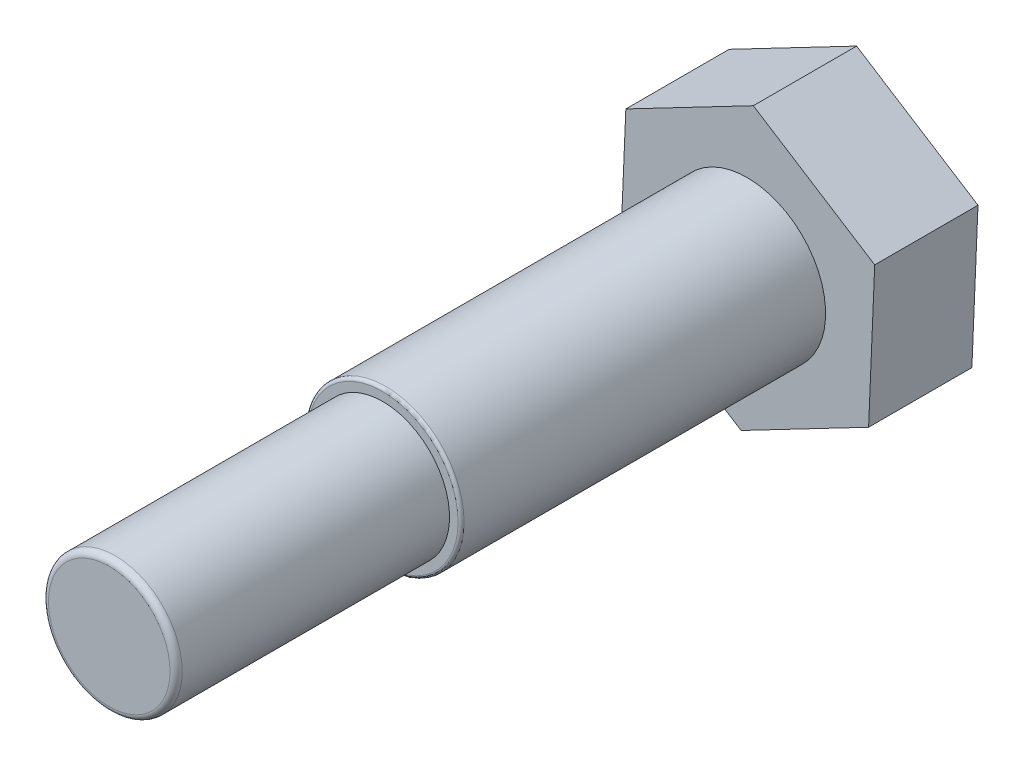
ISO-10303-21;
HEADER;
FILE_DESCRIPTION(('STEP AP214'),'2;1');
FILE_NAME('part.step','',(''),(''),'','','');
FILE_SCHEMA(('AUTOMOTIVE_DESIGN { 1 0 10303 214 1 1 1 1 }'));
ENDSEC;
DATA;
#1=APPLICATION_CONTEXT('core data for automotive mechanical design processes');
#2=APPLICATION_PROTOCOL_DEFINITION('international standard','automotive_design',2000,#1);
#3=PRODUCT_CONTEXT('',#1,'mechanical');
#4=PRODUCT('Part','Part','',(#3));
#5=PRODUCT_RELATED_PRODUCT_CATEGORY('part','',(#4));
#6=PRODUCT_DEFINITION_FORMATION('','',#4);
#7=PRODUCT_DEFINITION_CONTEXT('part definition',#1,'design');
#8=PRODUCT_DEFINITION('design','',#6,#7);
#9=PRODUCT_DEFINITION_SHAPE('','',#8);
#10=(LENGTH_UNIT() NAMED_UNIT(*) SI_UNIT(.MILLI.,.METRE.));
#11=(NAMED_UNIT(*) PLANE_ANGLE_UNIT() SI_UNIT($,.RADIAN.));
#12=(NAMED_UNIT(*) SI_UNIT($,.STERADIAN.) SOLID_ANGLE_UNIT());
#13=UNCERTAINTY_MEASURE_WITH_UNIT(LENGTH_MEASURE(1.E-05),#10,'distance_accuracy_value','');
#14=(GEOMETRIC_REPRESENTATION_CONTEXT(3) GLOBAL_UNCERTAINTY_ASSIGNED_CONTEXT((#13)) GLOBAL_UNIT_ASSIGNED_CONTEXT((#10,
#11,#12)) REPRESENTATION_CONTEXT('',''));
#15=CARTESIAN_POINT('',(0.,0.,0.));
#16=DIRECTION('',(0.,0.,1.));
#17=DIRECTION('',(1.,0.,0.));
#18=AXIS2_PLACEMENT_3D('',#15,#16,#17);
#19=CARTESIAN_POINT('',(19.9787997617734,-12.6957037383635,17.));
#20=DIRECTION('',(-0.999097599975706,0.0424733530909036,0.));
#21=DIRECTION('',(-0.0424733530909036,-0.999097599975706,0.));
#22=AXIS2_PLACEMENT_3D('',#19,#20,#21);
#23=PLANE('',#22);
#24=DIRECTION('',(0.0424733530909036,0.999097599975706,0.));
#25=VECTOR('',#24,1.);
#26=CARTESIAN_POINT('',(19.9787997617734,-12.6957037383635,0.));
#27=LINE('',#26,#25);
#28=CARTESIAN_POINT('',(19.9787997617734,-12.6957037383635,0.));
#29=VERTEX_POINT('',#28);
#30=CARTESIAN_POINT('',(20.9842018372306,10.9542962616365,0.));
#31=VERTEX_POINT('',#30);
#32=EDGE_CURVE('E121',#29,#31,#27,.T.);
#33=ORIENTED_EDGE('',*,*,#32,.T.);
#34=DIRECTION('',(0.,0.,-1.));
#35=VECTOR('',#34,1.);
#36=CARTESIAN_POINT('',(20.9842018372306,10.9542962616365,17.));
#37=LINE('',#36,#35);
#38=CARTESIAN_POINT('',(20.9842018372306,10.9542962616365,17.));
#39=VERTEX_POINT('',#38);
#40=EDGE_CURVE('E139',#39,#31,#37,.T.);
#41=ORIENTED_EDGE('',*,*,#40,.F.);
#42=DIRECTION('',(0.0424733530909036,0.999097599975706,0.));
#43=VECTOR('',#42,1.);
#44=CARTESIAN_POINT('',(19.9787997617734,-12.6957037383635,17.));
#45=LINE('',#44,#43);
#46=CARTESIAN_POINT('',(19.9787997617734,-12.6957037383635,17.));
#47=VERTEX_POINT('',#46);
#48=EDGE_CURVE('E132',#47,#39,#45,.T.);
#49=ORIENTED_EDGE('',*,*,#48,.F.);
#50=DIRECTION('',(0.,0.,-1.));
#51=VECTOR('',#50,1.);
#52=CARTESIAN_POINT('',(19.9787997617734,-12.6957037383635,17.));
#53=LINE('',#52,#51);
#54=EDGE_CURVE('E117',#47,#29,#53,.T.);
#55=ORIENTED_EDGE('',*,*,#54,.T.);
#56=EDGE_LOOP('',(#33,#41,#49,#55));
#57=FACE_BOUND('',#56,.T.);
#58=ADVANCED_FACE('F35',(#57),#23,.F.);
#59=CARTESIAN_POINT('',(20.9842018372306,10.9542962616365,17.));
#60=DIRECTION('',(-0.536331802748482,-0.844007225893572,0.));
#61=DIRECTION('',(0.844007225893572,-0.536331802748482,0.));
#62=AXIS2_PLACEMENT_3D('',#59,#60,#61);
#63=PLANE('',#62);
#64=DIRECTION('',(-0.844007225893572,0.536331802748482,0.));
#65=VECTOR('',#64,1.);
#66=CARTESIAN_POINT('',(20.9842018372306,10.9542962616365,0.));
#67=LINE('',#66,#65);
#68=CARTESIAN_POINT('',(1.0054020754572,23.65,0.));
#69=VERTEX_POINT('',#68);
#70=EDGE_CURVE('E124',#31,#69,#67,.T.);
#71=ORIENTED_EDGE('',*,*,#70,.T.);
#72=DIRECTION('',(0.,0.,-1.));
#73=VECTOR('',#72,1.);
#74=CARTESIAN_POINT('',(1.0054020754572,23.65,17.));
#75=LINE('',#74,#73);
#76=CARTESIAN_POINT('',(1.0054020754572,23.65,17.));
#77=VERTEX_POINT('',#76);
#78=EDGE_CURVE('E136',#77,#69,#75,.T.);
#79=ORIENTED_EDGE('',*,*,#78,.F.);
#80=DIRECTION('',(-0.844007225893572,0.536331802748482,0.));
#81=VECTOR('',#80,1.);
#82=CARTESIAN_POINT('',(20.9842018372306,10.9542962616365,17.));
#83=LINE('',#82,#81);
#84=EDGE_CURVE('E90',#39,#77,#83,.T.);
#85=ORIENTED_EDGE('',*,*,#84,.F.);
#86=ORIENTED_EDGE('',*,*,#40,.T.);
#87=EDGE_LOOP('',(#71,#79,#85,#86));
#88=FACE_BOUND('',#87,.T.);
#89=ADVANCED_FACE('F165',(#88),#63,.F.);
#90=CARTESIAN_POINT('',(1.0054020754572,23.65,17.));
#91=DIRECTION('',(0.462765797227231,-0.886480578984472,0.));
#92=DIRECTION('',(0.886480578984472,0.462765797227231,0.));
#93=AXIS2_PLACEMENT_3D('',#90,#91,#92);
#94=PLANE('',#93);
#95=DIRECTION('',(-0.886480578984472,-0.462765797227231,0.));
#96=VECTOR('',#95,1.);
#97=CARTESIAN_POINT('',(1.0054020754572,23.65,0.));
#98=LINE('',#97,#96);
#99=CARTESIAN_POINT('',(-19.9787997617736,12.6957037383632,0.));
#100=VERTEX_POINT('',#99);
#101=EDGE_CURVE('E127',#69,#100,#98,.T.);
#102=ORIENTED_EDGE('',*,*,#101,.T.);
#103=DIRECTION('',(0.,0.,-1.));
#104=VECTOR('',#103,1.);
#105=CARTESIAN_POINT('',(-19.9787997617736,12.6957037383632,17.));
#106=LINE('',#105,#104);
#107=CARTESIAN_POINT('',(-19.9787997617736,12.6957037383632,17.));
#108=VERTEX_POINT('',#107);
#109=EDGE_CURVE('E112',#108,#100,#106,.T.);
#110=ORIENTED_EDGE('',*,*,#109,.F.);
#111=DIRECTION('',(-0.886480578984472,-0.462765797227231,0.));
#112=VECTOR('',#111,1.);
#113=CARTESIAN_POINT('',(1.0054020754572,23.65,17.));
#114=LINE('',#113,#112);
#115=EDGE_CURVE('E103',#77,#108,#114,.T.);
#116=ORIENTED_EDGE('',*,*,#115,.F.);
#117=ORIENTED_EDGE('',*,*,#78,.T.);
#118=EDGE_LOOP('',(#102,#110,#116,#117));
#119=FACE_BOUND('',#118,.T.);
#120=ADVANCED_FACE('F171',(#119),#94,.F.);
#121=CARTESIAN_POINT('',(-19.9787997617736,12.6957037383632,17.));
#122=DIRECTION('',(0.999097599975706,-0.0424733530908878,0.));
#123=DIRECTION('',(0.0424733530908878,0.999097599975707,0.));
#124=AXIS2_PLACEMENT_3D('',#121,#122,#123);
#125=PLANE('',#124);
#126=DIRECTION('',(-0.0424733530908878,-0.999097599975706,0.));
#127=VECTOR('',#126,1.);
#128=CARTESIAN_POINT('',(-19.9787997617736,12.6957037383632,0.));
#129=LINE('',#128,#127);
#130=CARTESIAN_POINT('',(-20.9842018372304,-10.9542962616368,0.));
#131=VERTEX_POINT('',#130);
#132=EDGE_CURVE('E111',#100,#131,#129,.T.);
#133=ORIENTED_EDGE('',*,*,#132,.T.);
#134=DIRECTION('',(0.,0.,-1.));
#135=VECTOR('',#134,1.);
#136=CARTESIAN_POINT('',(-20.9842018372304,-10.9542962616368,17.));
#137=LINE('',#136,#135);
#138=CARTESIAN_POINT('',(-20.9842018372304,-10.9542962616368,17.));
#139=VERTEX_POINT('',#138);
#140=EDGE_CURVE('E108',#139,#131,#137,.T.);
#141=ORIENTED_EDGE('',*,*,#140,.F.);
#142=DIRECTION('',(-0.0424733530908878,-0.999097599975706,0.));
#143=VECTOR('',#142,1.);
#144=CARTESIAN_POINT('',(-19.9787997617736,12.6957037383632,17.));
#145=LINE('',#144,#143);
#146=EDGE_CURVE('E97',#108,#139,#145,.T.);
#147=ORIENTED_EDGE('',*,*,#146,.F.);
#148=ORIENTED_EDGE('',*,*,#109,.T.);
#149=EDGE_LOOP('',(#133,#141,#147,#148));
#150=FACE_BOUND('',#149,.T.);
#151=ADVANCED_FACE('F109',(#150),#125,.F.);
#152=CARTESIAN_POINT('',(-20.9842018372304,-10.9542962616368,17.));
#153=DIRECTION('',(0.536331802748476,0.844007225893576,0.));
#154=DIRECTION('',(-0.844007225893576,0.536331802748476,0.));
#155=AXIS2_PLACEMENT_3D('',#152,#153,#154);
#156=PLANE('',#155);
#157=DIRECTION('',(0.844007225893576,-0.536331802748476,0.));
#158=VECTOR('',#157,1.);
#159=CARTESIAN_POINT('',(-20.9842018372304,-10.9542962616368,0.));
#160=LINE('',#159,#158);
#161=CARTESIAN_POINT('',(-1.00540207545719,-23.65,0.));
#162=VERTEX_POINT('',#161);
#163=EDGE_CURVE('E75',#131,#162,#160,.T.);
#164=ORIENTED_EDGE('',*,*,#163,.T.);
#165=DIRECTION('',(0.,0.,-1.));
#166=VECTOR('',#165,1.);
#167=CARTESIAN_POINT('',(-1.00540207545719,-23.65,17.));
#168=LINE('',#167,#166);
#169=CARTESIAN_POINT('',(-1.00540207545719,-23.65,17.));
#170=VERTEX_POINT('',#169);
#171=EDGE_CURVE('E113',#170,#162,#168,.T.);
#172=ORIENTED_EDGE('',*,*,#171,.F.);
#173=DIRECTION('',(0.844007225893576,-0.536331802748476,0.));
#174=VECTOR('',#173,1.);
#175=CARTESIAN_POINT('',(-20.9842018372304,-10.9542962616368,17.));
#176=LINE('',#175,#174);
#177=EDGE_CURVE('E101',#139,#170,#176,.T.);
#178=ORIENTED_EDGE('',*,*,#177,.F.);
#179=ORIENTED_EDGE('',*,*,#140,.T.);
#180=EDGE_LOOP('',(#164,#172,#178,#179));
#181=FACE_BOUND('',#180,.T.);
#182=ADVANCED_FACE('F115',(#181),#156,.F.);
#183=CARTESIAN_POINT('',(-1.00540207545719,-23.65,17.));
#184=DIRECTION('',(-0.462765797227224,0.886480578984476,0.));
#185=DIRECTION('',(-0.886480578984476,-0.462765797227224,0.));
#186=AXIS2_PLACEMENT_3D('',#183,#184,#185);
#187=PLANE('',#186);
#188=DIRECTION('',(0.886480578984476,0.462765797227224,0.));
#189=VECTOR('',#188,1.);
#190=CARTESIAN_POINT('',(-1.00540207545719,-23.65,0.));
#191=LINE('',#190,#189);
#192=EDGE_CURVE('E81',#162,#29,#191,.T.);
#193=ORIENTED_EDGE('',*,*,#192,.T.);
#194=ORIENTED_EDGE('',*,*,#54,.F.);
#195=DIRECTION('',(0.886480578984476,0.462765797227224,0.));
#196=VECTOR('',#195,1.);
#197=CARTESIAN_POINT('',(-1.00540207545719,-23.65,17.));
#198=LINE('',#197,#196);
#199=EDGE_CURVE('E52',#170,#47,#198,.T.);
#200=ORIENTED_EDGE('',*,*,#199,.F.);
#201=ORIENTED_EDGE('',*,*,#171,.T.);
#202=EDGE_LOOP('',(#193,#194,#200,#201));
#203=FACE_BOUND('',#202,.T.);
#204=ADVANCED_FACE('F181',(#203),#187,.F.);
#205=CARTESIAN_POINT('',(18.9733976863162,-36.3457037383633,17.));
#206=DIRECTION('',(0.,0.,-1.));
#207=DIRECTION('',(-1.,0.,0.));
#208=AXIS2_PLACEMENT_3D('',#205,#206,#207);
#209=PLANE('',#208);
#210=CARTESIAN_POINT('',(0.,0.,17.));
#211=DIRECTION('',(0.,0.,-1.));
#212=DIRECTION('',(-1.,0.,0.));
#213=AXIS2_PLACEMENT_3D('',#210,#211,#212);
#214=CIRCLE('',#213,12.9);
#215=CARTESIAN_POINT('',(-12.9,0.,17.));
#216=VERTEX_POINT('',#215);
#217=EDGE_CURVE('E141',#216,#216,#214,.F.);
#218=ORIENTED_EDGE('',*,*,#217,.F.);
#219=EDGE_LOOP('',(#218));
#220=FACE_BOUND('',#219,.T.);
#221=ORIENTED_EDGE('',*,*,#48,.T.);
#222=ORIENTED_EDGE('',*,*,#84,.T.);
#223=ORIENTED_EDGE('',*,*,#115,.T.);
#224=ORIENTED_EDGE('',*,*,#146,.T.);
#225=ORIENTED_EDGE('',*,*,#177,.T.);
#226=ORIENTED_EDGE('',*,*,#199,.T.);
#227=EDGE_LOOP('',(#221,#222,#223,#224,#225,#226));
#228=FACE_BOUND('',#227,.T.);
#229=ADVANCED_FACE('F99',(#220,#228),#209,.F.);
#230=CARTESIAN_POINT('',(18.9733976863162,-36.3457037383633,0.));
#231=DIRECTION('',(0.,0.,-1.));
#232=DIRECTION('',(-1.,0.,0.));
#233=AXIS2_PLACEMENT_3D('',#230,#231,#232);
#234=PLANE('',#233);
#235=ORIENTED_EDGE('',*,*,#32,.F.);
#236=ORIENTED_EDGE('',*,*,#192,.F.);
#237=ORIENTED_EDGE('',*,*,#163,.F.);
#238=ORIENTED_EDGE('',*,*,#132,.F.);
#239=ORIENTED_EDGE('',*,*,#101,.F.);
#240=ORIENTED_EDGE('',*,*,#70,.F.);
#241=EDGE_LOOP('',(#235,#236,#237,#238,#239,#240));
#242=FACE_BOUND('',#241,.T.);
#243=ADVANCED_FACE('F184',(#242),#234,.T.);
#244=CARTESIAN_POINT('',(0.,0.,77.));
#245=DIRECTION('',(0.,0.,-1.));
#246=DIRECTION('',(-1.,0.,0.));
#247=AXIS2_PLACEMENT_3D('',#244,#245,#246);
#248=CYLINDRICAL_SURFACE('',#247,12.9);
#249=CARTESIAN_POINT('',(0.,0.,76.5));
#250=DIRECTION('',(0.,0.,1.));
#251=DIRECTION('',(1.,0.,0.));
#252=AXIS2_PLACEMENT_3D('',#249,#250,#251);
#253=CIRCLE('',#252,12.9);
#254=CARTESIAN_POINT('',(12.9,0.,76.5));
#255=VERTEX_POINT('',#254);
#256=EDGE_CURVE('E11',#255,#255,#253,.F.);
#257=ORIENTED_EDGE('',*,*,#256,.T.);
#258=EDGE_LOOP('',(#257));
#259=FACE_BOUND('',#258,.T.);
#260=ORIENTED_EDGE('',*,*,#217,.T.);
#261=EDGE_LOOP('',(#260));
#262=FACE_BOUND('',#261,.T.);
#263=ADVANCED_FACE('F187',(#259,#262),#248,.T.);
#264=CARTESIAN_POINT('',(0.,0.,77.));
#265=DIRECTION('',(0.,0.,1.));
#266=DIRECTION('',(1.,0.,0.));
#267=AXIS2_PLACEMENT_3D('',#264,#265,#266);
#268=PLANE('',#267);
#269=CARTESIAN_POINT('',(0.,0.,77.));
#270=DIRECTION('',(0.,0.,1.));
#271=DIRECTION('',(1.,0.,0.));
#272=AXIS2_PLACEMENT_3D('',#269,#270,#271);
#273=CIRCLE('',#272,12.4);
#274=CARTESIAN_POINT('',(12.4,0.,77.));
#275=VERTEX_POINT('',#274);
#276=EDGE_CURVE('E44',#275,#275,#273,.T.);
#277=ORIENTED_EDGE('',*,*,#276,.T.);
#278=EDGE_LOOP('',(#277));
#279=FACE_BOUND('',#278,.T.);
#280=CARTESIAN_POINT('',(0.,0.,77.));
#281=DIRECTION('',(0.,0.,1.));
#282=DIRECTION('',(1.,0.,0.));
#283=AXIS2_PLACEMENT_3D('',#280,#281,#282);
#284=CIRCLE('',#283,11.);
#285=CARTESIAN_POINT('',(-11.,0.,77.));
#286=VERTEX_POINT('',#285);
#287=EDGE_CURVE('E125',#286,#286,#284,.T.);
#288=ORIENTED_EDGE('',*,*,#287,.F.);
#289=EDGE_LOOP('',(#288));
#290=FACE_BOUND('',#289,.T.);
#291=ADVANCED_FACE('F152',(#279,#290),#268,.T.);
#292=CARTESIAN_POINT('',(0.,0.,122.));
#293=DIRECTION('',(0.,0.,-1.));
#294=DIRECTION('',(-1.,0.,0.));
#295=AXIS2_PLACEMENT_3D('',#292,#293,#294);
#296=CYLINDRICAL_SURFACE('',#295,11.);
#297=CARTESIAN_POINT('',(0.,0.,121.));
#298=DIRECTION('',(0.,0.,1.));
#299=DIRECTION('',(1.,0.,0.));
#300=AXIS2_PLACEMENT_3D('',#297,#298,#299);
#301=CIRCLE('',#300,11.);
#302=CARTESIAN_POINT('',(-11.,0.,121.));
#303=VERTEX_POINT('',#302);
#304=EDGE_CURVE('E147',#303,#303,#301,.F.);
#305=CARTESIAN_POINT('',(-11.,0.,121.));
#306=CARTESIAN_POINT('',(-11.,0.,120.541666666667));
#307=CARTESIAN_POINT('',(-11.,0.,120.083333333333));
#308=CARTESIAN_POINT('',(-11.,0.,119.166666666667));
#309=CARTESIAN_POINT('',(-11.,0.,118.708333333333));
#310=CARTESIAN_POINT('',(-11.,0.,117.791666666667));
#311=CARTESIAN_POINT('',(-11.,0.,117.333333333333));
#312=CARTESIAN_POINT('',(-11.,0.,116.416666666667));
#313=CARTESIAN_POINT('',(-11.,0.,115.958333333333));
#314=CARTESIAN_POINT('',(-11.,0.,115.041666666667));
#315=CARTESIAN_POINT('',(-11.,0.,114.583333333333));
#316=CARTESIAN_POINT('',(-11.,0.,113.666666666667));
#317=CARTESIAN_POINT('',(-11.,0.,113.208333333333));
#318=CARTESIAN_POINT('',(-11.,0.,112.291666666667));
#319=CARTESIAN_POINT('',(-11.,0.,111.833333333333));
#320=CARTESIAN_POINT('',(-11.,0.,110.916666666667));
#321=CARTESIAN_POINT('',(-11.,0.,110.458333333333));
#322=CARTESIAN_POINT('',(-11.,0.,109.541666666667));
#323=CARTESIAN_POINT('',(-11.,0.,109.083333333333));
#324=CARTESIAN_POINT('',(-11.,0.,108.166666666667));
#325=CARTESIAN_POINT('',(-11.,0.,107.708333333333));
#326=CARTESIAN_POINT('',(-11.,0.,106.791666666667));
#327=CARTESIAN_POINT('',(-11.,0.,106.333333333333));
#328=CARTESIAN_POINT('',(-11.,0.,105.416666666667));
#329=CARTESIAN_POINT('',(-11.,0.,104.958333333333));
#330=CARTESIAN_POINT('',(-11.,0.,104.041666666667));
#331=CARTESIAN_POINT('',(-11.,0.,103.583333333333));
#332=CARTESIAN_POINT('',(-11.,0.,102.666666666667));
#333=CARTESIAN_POINT('',(-11.,0.,102.208333333333));
#334=CARTESIAN_POINT('',(-11.,0.,101.291666666667));
#335=CARTESIAN_POINT('',(-11.,0.,100.833333333333));
#336=CARTESIAN_POINT('',(-11.,0.,99.9166666666667));
#337=CARTESIAN_POINT('',(-11.,0.,99.4583333333333));
#338=CARTESIAN_POINT('',(-11.,0.,98.5416666666667));
#339=CARTESIAN_POINT('',(-11.,0.,98.0833333333333));
#340=CARTESIAN_POINT('',(-11.,0.,97.1666666666667));
#341=CARTESIAN_POINT('',(-11.,0.,96.7083333333333));
#342=CARTESIAN_POINT('',(-11.,0.,95.7916666666666));
#343=CARTESIAN_POINT('',(-11.,0.,95.3333333333333));
#344=CARTESIAN_POINT('',(-11.,0.,94.4166666666666));
#345=CARTESIAN_POINT('',(-11.,0.,93.9583333333333));
#346=CARTESIAN_POINT('',(-11.,0.,93.0416666666666));
#347=CARTESIAN_POINT('',(-11.,0.,92.5833333333333));
#348=CARTESIAN_POINT('',(-11.,0.,91.6666666666667));
#349=CARTESIAN_POINT('',(-11.,0.,91.2083333333333));
#350=CARTESIAN_POINT('',(-11.,0.,90.2916666666667));
#351=CARTESIAN_POINT('',(-11.,0.,89.8333333333333));
#352=CARTESIAN_POINT('',(-11.,0.,88.9166666666667));
#353=CARTESIAN_POINT('',(-11.,0.,88.4583333333333));
#354=CARTESIAN_POINT('',(-11.,0.,87.5416666666667));
#355=CARTESIAN_POINT('',(-11.,0.,87.0833333333333));
#356=CARTESIAN_POINT('',(-11.,0.,86.1666666666667));
#357=CARTESIAN_POINT('',(-11.,0.,85.7083333333333));
#358=CARTESIAN_POINT('',(-11.,0.,84.7916666666667));
#359=CARTESIAN_POINT('',(-11.,0.,84.3333333333333));
#360=CARTESIAN_POINT('',(-11.,0.,83.4166666666667));
#361=CARTESIAN_POINT('',(-11.,0.,82.9583333333333));
#362=CARTESIAN_POINT('',(-11.,0.,82.0416666666667));
#363=CARTESIAN_POINT('',(-11.,0.,81.5833333333333));
#364=CARTESIAN_POINT('',(-11.,0.,80.6666666666667));
#365=CARTESIAN_POINT('',(-11.,0.,80.2083333333333));
#366=CARTESIAN_POINT('',(-11.,0.,79.2916666666667));
#367=CARTESIAN_POINT('',(-11.,0.,78.8333333333333));
#368=CARTESIAN_POINT('',(-11.,0.,77.9166666666667));
#369=CARTESIAN_POINT('',(-11.,0.,77.4583333333333));
#370=CARTESIAN_POINT('',(-11.,0.,77.));
#371=B_SPLINE_CURVE_WITH_KNOTS('',3,(#305,#306,#307,#308,#309,#310,#311,#312,#313,#314,#315,
#316,#317,#318,#319,#320,#321,#322,#323,#324,#325,#326,#327,#328,#329,#330,#331,#332,#333,#334,
#335,#336,#337,#338,#339,#340,#341,#342,#343,#344,#345,#346,#347,#348,#349,#350,#351,#352,#353,
#354,#355,#356,#357,#358,#359,#360,#361,#362,#363,#364,#365,#366,#367,#368,#369,#370),
.UNSPECIFIED.,.F.,.F.,(4,2,2,2,2,2,2,2,2,2,2,2,2,2,2,2,2,2,2,2,2,2,2,2,2,2,2,2,2,2,2,2,4),(0.,
1.37499999999999,2.74999999999999,4.12499999999999,5.49999999999999,6.87499999999999,
8.24999999999999,9.62499999999999,11.,12.375,13.75,15.125,16.5,17.875,19.25,20.625,22.,23.375,
24.75,26.125,27.5,28.875,30.25,31.625,33.,34.375,35.75,37.125,38.5,39.875,41.25,42.625,44.),.UNSPECIFIED.);
#372=EDGE_CURVE('BSEAM197',#303,#286,#371,.T.);
#373=ORIENTED_EDGE('',*,*,#304,.T.);
#374=ORIENTED_EDGE('',*,*,#287,.T.);
#375=ORIENTED_EDGE('',*,*,#372,.T.);
#376=ORIENTED_EDGE('',*,*,#372,.F.);
#377=EDGE_LOOP('',(#373,#375,#374,#376));
#378=FACE_BOUND('',#377,.T.);
#379=ADVANCED_FACE('F197',(#378),#296,.T.);
#380=CARTESIAN_POINT('',(0.,0.,122.));
#381=DIRECTION('',(0.,0.,1.));
#382=DIRECTION('',(1.,0.,0.));
#383=AXIS2_PLACEMENT_3D('',#380,#381,#382);
#384=PLANE('',#383);
#385=CARTESIAN_POINT('',(0.,0.,122.));
#386=DIRECTION('',(0.,0.,1.));
#387=DIRECTION('',(1.,0.,0.));
#388=AXIS2_PLACEMENT_3D('',#385,#386,#387);
#389=CIRCLE('',#388,10.);
#390=CARTESIAN_POINT('',(10.,0.,122.));
#391=VERTEX_POINT('',#390);
#392=EDGE_CURVE('E144',#391,#391,#389,.T.);
#393=ORIENTED_EDGE('',*,*,#392,.T.);
#394=EDGE_LOOP('',(#393));
#395=FACE_BOUND('',#394,.T.);
#396=ADVANCED_FACE('F161',(#395),#384,.T.);
#397=CARTESIAN_POINT('',(0.,0.,121.));
#398=DIRECTION('',(0.,0.,1.));
#399=DIRECTION('',(1.,0.,0.));
#400=AXIS2_PLACEMENT_3D('',#397,#398,#399);
#401=TOROIDAL_SURFACE('',#400,10.,1.);
#402=ORIENTED_EDGE('',*,*,#304,.F.);
#403=EDGE_LOOP('',(#402));
#404=FACE_BOUND('',#403,.T.);
#405=ORIENTED_EDGE('',*,*,#392,.F.);
#406=EDGE_LOOP('',(#405));
#407=FACE_BOUND('',#406,.T.);
#408=ADVANCED_FACE('F156',(#404,#407),#401,.T.);
#409=CARTESIAN_POINT('',(0.,0.,76.5));
#410=DIRECTION('',(0.,0.,1.));
#411=DIRECTION('',(1.,0.,0.));
#412=AXIS2_PLACEMENT_3D('',#409,#410,#411);
#413=TOROIDAL_SURFACE('',#412,12.4,0.5);
#414=ORIENTED_EDGE('',*,*,#256,.F.);
#415=EDGE_LOOP('',(#414));
#416=FACE_BOUND('',#415,.T.);
#417=ORIENTED_EDGE('',*,*,#276,.F.);
#418=EDGE_LOOP('',(#417));
#419=FACE_BOUND('',#418,.T.);
#420=ADVANCED_FACE('F37',(#416,#419),#413,.T.);
#421=CLOSED_SHELL('',(#58,#89,#120,#151,#182,#204,#229,#243,#263,#291,#379,#396,#408,#420));
#422=MANIFOLD_SOLID_BREP('B2',#421);
#423=ADVANCED_BREP_SHAPE_REPRESENTATION('',(#18,#422),#14);
#424=SHAPE_DEFINITION_REPRESENTATION(#9,#423);
ENDSEC;
END-ISO-10303-21;
